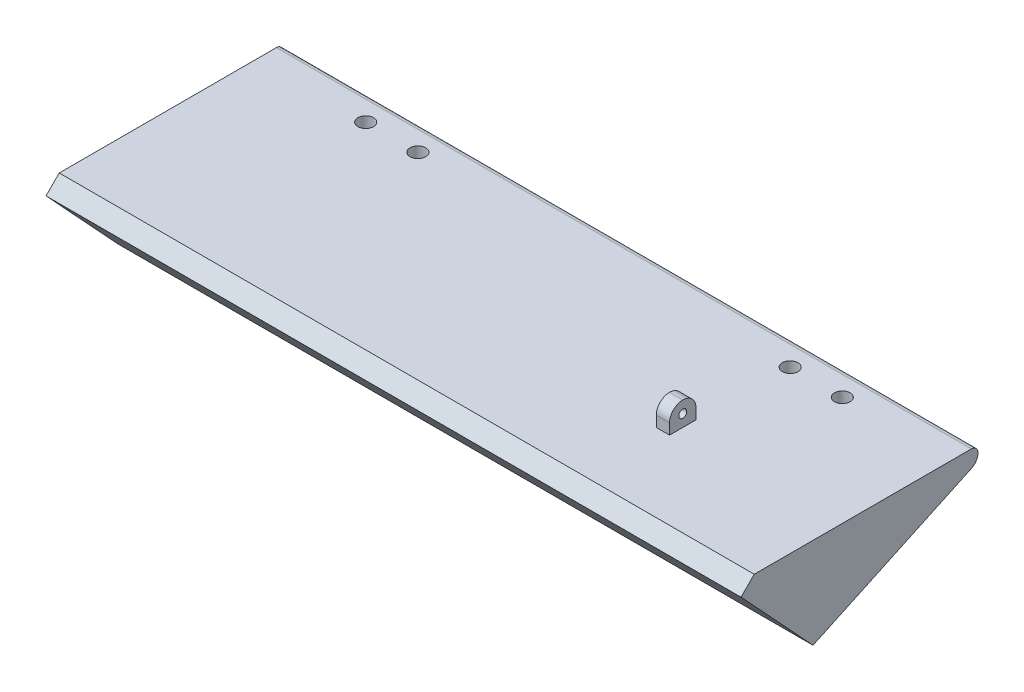
ISO-10303-21;
HEADER;
FILE_DESCRIPTION(('STEP AP214'),'2;1');
FILE_NAME('part.step','',(''),(''),'','','');
FILE_SCHEMA(('AUTOMOTIVE_DESIGN { 1 0 10303 214 1 1 1 1 }'));
ENDSEC;
DATA;
#1=APPLICATION_CONTEXT('core data for automotive mechanical design processes');
#2=APPLICATION_PROTOCOL_DEFINITION('international standard','automotive_design',2000,#1);
#3=PRODUCT_CONTEXT('',#1,'mechanical');
#4=PRODUCT('Part','Part','',(#3));
#5=PRODUCT_RELATED_PRODUCT_CATEGORY('part','',(#4));
#6=PRODUCT_DEFINITION_FORMATION('','',#4);
#7=PRODUCT_DEFINITION_CONTEXT('part definition',#1,'design');
#8=PRODUCT_DEFINITION('design','',#6,#7);
#9=PRODUCT_DEFINITION_SHAPE('','',#8);
#10=(LENGTH_UNIT() NAMED_UNIT(*) SI_UNIT(.MILLI.,.METRE.));
#11=(NAMED_UNIT(*) PLANE_ANGLE_UNIT() SI_UNIT($,.RADIAN.));
#12=(NAMED_UNIT(*) SI_UNIT($,.STERADIAN.) SOLID_ANGLE_UNIT());
#13=UNCERTAINTY_MEASURE_WITH_UNIT(LENGTH_MEASURE(1.E-05),#10,'distance_accuracy_value','');
#14=(GEOMETRIC_REPRESENTATION_CONTEXT(3) GLOBAL_UNCERTAINTY_ASSIGNED_CONTEXT((#13)) GLOBAL_UNIT_ASSIGNED_CONTEXT((#10,
#11,#12)) REPRESENTATION_CONTEXT('',''));
#15=CARTESIAN_POINT('',(0.,0.,0.));
#16=DIRECTION('',(0.,0.,1.));
#17=DIRECTION('',(1.,0.,0.));
#18=AXIS2_PLACEMENT_3D('',#15,#16,#17);
#19=CARTESIAN_POINT('',(0.,2.54,0.));
#20=DIRECTION('',(0.,1.,0.));
#21=DIRECTION('',(0.,0.,1.));
#22=AXIS2_PLACEMENT_3D('',#19,#20,#21);
#23=PLANE('',#22);
#24=CARTESIAN_POINT('',(20.955,2.53999999999997,5.07999999999998));
#25=DIRECTION('',(0.,-1.,0.));
#26=DIRECTION('',(0.,0.,-1.));
#27=AXIS2_PLACEMENT_3D('',#24,#25,#26);
#28=CIRCLE('',#27,1.4986);
#29=CARTESIAN_POINT('',(20.955,2.53999999999997,3.58139999999998));
#30=VERTEX_POINT('',#29);
#31=EDGE_CURVE('E227',#30,#30,#28,.T.);
#32=ORIENTED_EDGE('',*,*,#31,.T.);
#33=EDGE_LOOP('',(#32));
#34=FACE_BOUND('',#33,.T.);
#35=CARTESIAN_POINT('',(30.9626,2.53999999999997,5.07999999999997));
#36=DIRECTION('',(0.,-1.,0.));
#37=DIRECTION('',(0.,0.,-1.));
#38=AXIS2_PLACEMENT_3D('',#35,#36,#37);
#39=CIRCLE('',#38,1.4986);
#40=CARTESIAN_POINT('',(30.9626,2.53999999999997,3.58139999999997));
#41=VERTEX_POINT('',#40);
#42=EDGE_CURVE('E221',#41,#41,#39,.T.);
#43=ORIENTED_EDGE('',*,*,#42,.T.);
#44=EDGE_LOOP('',(#43));
#45=FACE_BOUND('',#44,.T.);
#46=CARTESIAN_POINT('',(102.3874,2.53999999999997,5.07999999999998));
#47=DIRECTION('',(0.,-1.,0.));
#48=DIRECTION('',(0.,0.,-1.));
#49=AXIS2_PLACEMENT_3D('',#46,#47,#48);
#50=CIRCLE('',#49,1.4986);
#51=CARTESIAN_POINT('',(102.3874,2.53999999999997,3.58139999999998));
#52=VERTEX_POINT('',#51);
#53=EDGE_CURVE('E215',#52,#52,#50,.T.);
#54=ORIENTED_EDGE('',*,*,#53,.T.);
#55=EDGE_LOOP('',(#54));
#56=FACE_BOUND('',#55,.T.);
#57=CARTESIAN_POINT('',(112.395,2.53999999999997,5.07999999999998));
#58=DIRECTION('',(0.,-1.,0.));
#59=DIRECTION('',(0.,0.,-1.));
#60=AXIS2_PLACEMENT_3D('',#57,#58,#59);
#61=CIRCLE('',#60,1.4986);
#62=CARTESIAN_POINT('',(112.395,2.53999999999997,3.58139999999998));
#63=VERTEX_POINT('',#62);
#64=EDGE_CURVE('E209',#63,#63,#61,.T.);
#65=ORIENTED_EDGE('',*,*,#64,.T.);
#66=EDGE_LOOP('',(#65));
#67=FACE_BOUND('',#66,.T.);
#68=DIRECTION('',(0.,0.,-1.));
#69=VECTOR('',#68,1.);
#70=CARTESIAN_POINT('',(133.35,2.54,0.));
#71=LINE('',#70,#69);
#72=CARTESIAN_POINT('',(133.35,2.54,42.926));
#73=VERTEX_POINT('',#72);
#74=CARTESIAN_POINT('',(133.35,2.54,1.27));
#75=VERTEX_POINT('',#74);
#76=EDGE_CURVE('E157',#73,#75,#71,.T.);
#77=ORIENTED_EDGE('',*,*,#76,.T.);
#78=DIRECTION('',(-1.,0.,0.));
#79=VECTOR('',#78,1.);
#80=CARTESIAN_POINT('',(0.,2.54,1.27));
#81=LINE('',#80,#79);
#82=CARTESIAN_POINT('',(0.,2.54,1.27));
#83=VERTEX_POINT('',#82);
#84=EDGE_CURVE('E135',#75,#83,#81,.T.);
#85=ORIENTED_EDGE('',*,*,#84,.T.);
#86=DIRECTION('',(0.,0.,1.));
#87=VECTOR('',#86,1.);
#88=CARTESIAN_POINT('',(0.,2.54,0.));
#89=LINE('',#88,#87);
#90=CARTESIAN_POINT('',(0.,2.54,42.926));
#91=VERTEX_POINT('',#90);
#92=EDGE_CURVE('E165',#83,#91,#89,.T.);
#93=ORIENTED_EDGE('',*,*,#92,.T.);
#94=DIRECTION('',(1.,0.,0.));
#95=VECTOR('',#94,1.);
#96=CARTESIAN_POINT('',(0.,2.54,42.926));
#97=LINE('',#96,#95);
#98=EDGE_CURVE('E166',#91,#73,#97,.T.);
#99=ORIENTED_EDGE('',*,*,#98,.T.);
#100=EDGE_LOOP('',(#77,#85,#93,#99));
#101=FACE_BOUND('',#100,.T.);
#102=DIRECTION('',(-1.,0.,0.));
#103=VECTOR('',#102,1.);
#104=CARTESIAN_POINT('',(102.108,2.54,22.86));
#105=LINE('',#104,#103);
#106=CARTESIAN_POINT('',(102.108,2.54,22.86));
#107=VERTEX_POINT('',#106);
#108=CARTESIAN_POINT('',(99.568,2.54,22.86));
#109=VERTEX_POINT('',#108);
#110=EDGE_CURVE('E190',#107,#109,#105,.T.);
#111=ORIENTED_EDGE('',*,*,#110,.F.);
#112=DIRECTION('',(0.,0.,-1.));
#113=VECTOR('',#112,1.);
#114=CARTESIAN_POINT('',(102.108,2.54,27.94));
#115=LINE('',#114,#113);
#116=CARTESIAN_POINT('',(102.108,2.54,27.94));
#117=VERTEX_POINT('',#116);
#118=EDGE_CURVE('E161',#117,#107,#115,.T.);
#119=ORIENTED_EDGE('',*,*,#118,.F.);
#120=DIRECTION('',(1.,0.,0.));
#121=VECTOR('',#120,1.);
#122=CARTESIAN_POINT('',(102.108,2.54,27.94));
#123=LINE('',#122,#121);
#124=CARTESIAN_POINT('',(99.568,2.54,27.94));
#125=VERTEX_POINT('',#124);
#126=EDGE_CURVE('E184',#125,#117,#123,.T.);
#127=ORIENTED_EDGE('',*,*,#126,.F.);
#128=DIRECTION('',(0.,0.,1.));
#129=VECTOR('',#128,1.);
#130=CARTESIAN_POINT('',(99.568,2.54,27.94));
#131=LINE('',#130,#129);
#132=EDGE_CURVE('E187',#109,#125,#131,.T.);
#133=ORIENTED_EDGE('',*,*,#132,.F.);
#134=EDGE_LOOP('',(#111,#119,#127,#133));
#135=FACE_BOUND('',#134,.T.);
#136=ADVANCED_FACE('F36',(#34,#45,#56,#67,#101,#135),#23,.T.);
#137=CARTESIAN_POINT('',(0.,2.54,0.));
#138=DIRECTION('',(1.,0.,0.));
#139=DIRECTION('',(0.,0.,-1.));
#140=AXIS2_PLACEMENT_3D('',#137,#138,#139);
#141=PLANE('',#140);
#142=DIRECTION('',(0.,0.733399200194749,0.679798215026859));
#143=VECTOR('',#142,1.);
#144=CARTESIAN_POINT('',(0.,-22.6676865994659,24.4549968723537));
#145=LINE('',#144,#143);
#146=CARTESIAN_POINT('',(0.,-14.9026717479573,31.6525002706542));
#147=VERTEX_POINT('',#146);
#148=CARTESIAN_POINT('',(0.,0.,45.466));
#149=VERTEX_POINT('',#148);
#150=EDGE_CURVE('E130',#147,#149,#145,.T.);
#151=ORIENTED_EDGE('',*,*,#150,.T.);
#152=DIRECTION('',(0.,0.707106781186544,-0.707106781186552));
#153=VECTOR('',#152,1.);
#154=CARTESIAN_POINT('',(0.,2.54,42.926));
#155=LINE('',#154,#153);
#156=EDGE_CURVE('E171',#149,#91,#155,.T.);
#157=ORIENTED_EDGE('',*,*,#156,.T.);
#158=ORIENTED_EDGE('',*,*,#92,.F.);
#159=CARTESIAN_POINT('',(0.,1.27,1.27));
#160=DIRECTION('',(1.,0.,0.));
#161=DIRECTION('',(0.,0.,-1.));
#162=AXIS2_PLACEMENT_3D('',#159,#160,#161);
#163=CIRCLE('',#162,1.27);
#164=CARTESIAN_POINT('',(0.,1.27,0.));
#165=VERTEX_POINT('',#164);
#166=EDGE_CURVE('E45',#83,#165,#163,.F.);
#167=ORIENTED_EDGE('',*,*,#166,.T.);
#168=CARTESIAN_POINT('',(0.,1.27,2.20060500212836));
#169=DIRECTION('',(-1.,0.,0.));
#170=DIRECTION('',(0.,0.,1.));
#171=AXIS2_PLACEMENT_3D('',#168,#169,#170);
#172=CIRCLE('',#171,2.20060500212836);
#173=CARTESIAN_POINT('',(0.,-0.724150622547361,1.27));
#174=VERTEX_POINT('',#173);
#175=EDGE_CURVE('E52',#174,#165,#172,.F.);
#176=ORIENTED_EDGE('',*,*,#175,.F.);
#177=DIRECTION('',(0.,0.422885979641193,-0.906182899983722));
#178=VECTOR('',#177,1.);
#179=CARTESIAN_POINT('',(0.,-0.107969623736231,-0.0503858990342978));
#180=LINE('',#179,#178);
#181=EDGE_CURVE('E203',#147,#174,#180,.T.);
#182=ORIENTED_EDGE('',*,*,#181,.F.);
#183=EDGE_LOOP('',(#151,#157,#158,#167,#176,#182));
#184=FACE_BOUND('',#183,.T.);
#185=ADVANCED_FACE('F245',(#184),#141,.F.);
#186=CARTESIAN_POINT('',(133.35,2.54,0.));
#187=DIRECTION('',(-1.,0.,0.));
#188=DIRECTION('',(0.,0.,1.));
#189=AXIS2_PLACEMENT_3D('',#186,#187,#188);
#190=PLANE('',#189);
#191=DIRECTION('',(0.,0.707106781186544,-0.707106781186552));
#192=VECTOR('',#191,1.);
#193=CARTESIAN_POINT('',(133.35,2.54,42.926));
#194=LINE('',#193,#192);
#195=CARTESIAN_POINT('',(133.35,0.,45.466));
#196=VERTEX_POINT('',#195);
#197=EDGE_CURVE('E172',#196,#73,#194,.T.);
#198=ORIENTED_EDGE('',*,*,#197,.F.);
#199=DIRECTION('',(0.,0.733399200194749,0.679798215026859));
#200=VECTOR('',#199,1.);
#201=CARTESIAN_POINT('',(133.35,-22.6676865994659,24.4549968723537));
#202=LINE('',#201,#200);
#203=CARTESIAN_POINT('',(133.35,-14.9026717479573,31.6525002706542));
#204=VERTEX_POINT('',#203);
#205=EDGE_CURVE('E199',#204,#196,#202,.T.);
#206=ORIENTED_EDGE('',*,*,#205,.F.);
#207=DIRECTION('',(0.,0.422885979641193,-0.906182899983722));
#208=VECTOR('',#207,1.);
#209=CARTESIAN_POINT('',(133.35,-0.107969623736231,-0.0503858990343142));
#210=LINE('',#209,#208);
#211=CARTESIAN_POINT('',(133.35,-0.724150622547361,1.26999999999998));
#212=VERTEX_POINT('',#211);
#213=EDGE_CURVE('E128',#204,#212,#210,.T.);
#214=ORIENTED_EDGE('',*,*,#213,.T.);
#215=CARTESIAN_POINT('',(133.35,1.27,2.20060500212835));
#216=DIRECTION('',(-1.,0.,0.));
#217=DIRECTION('',(0.,0.,1.));
#218=AXIS2_PLACEMENT_3D('',#215,#216,#217);
#219=CIRCLE('',#218,2.20060500212836);
#220=CARTESIAN_POINT('',(133.35,1.27,0.));
#221=VERTEX_POINT('',#220);
#222=EDGE_CURVE('E120',#212,#221,#219,.F.);
#223=ORIENTED_EDGE('',*,*,#222,.T.);
#224=CARTESIAN_POINT('',(133.35,1.27,1.27));
#225=DIRECTION('',(-1.,0.,0.));
#226=DIRECTION('',(0.,0.,1.));
#227=AXIS2_PLACEMENT_3D('',#224,#225,#226);
#228=CIRCLE('',#227,1.27);
#229=EDGE_CURVE('E11',#221,#75,#228,.F.);
#230=ORIENTED_EDGE('',*,*,#229,.T.);
#231=ORIENTED_EDGE('',*,*,#76,.F.);
#232=EDGE_LOOP('',(#198,#206,#214,#223,#230,#231));
#233=FACE_BOUND('',#232,.T.);
#234=ADVANCED_FACE('F122',(#233),#190,.F.);
#235=CARTESIAN_POINT('',(0.,2.54,42.926));
#236=DIRECTION('',(0.,-0.707106781186551,-0.707106781186543));
#237=DIRECTION('',(0.,0.707106781186544,-0.707106781186552));
#238=AXIS2_PLACEMENT_3D('',#235,#236,#237);
#239=PLANE('',#238);
#240=ORIENTED_EDGE('',*,*,#197,.T.);
#241=ORIENTED_EDGE('',*,*,#98,.F.);
#242=ORIENTED_EDGE('',*,*,#156,.F.);
#243=DIRECTION('',(1.,0.,0.));
#244=VECTOR('',#243,1.);
#245=CARTESIAN_POINT('',(0.,0.,45.466));
#246=LINE('',#245,#244);
#247=EDGE_CURVE('E162',#149,#196,#246,.T.);
#248=ORIENTED_EDGE('',*,*,#247,.T.);
#249=EDGE_LOOP('',(#240,#241,#242,#248));
#250=FACE_BOUND('',#249,.T.);
#251=ADVANCED_FACE('F256',(#250),#239,.F.);
#252=CARTESIAN_POINT('',(102.108,7.112,27.94));
#253=DIRECTION('',(-1.,0.,0.));
#254=DIRECTION('',(0.,0.,1.));
#255=AXIS2_PLACEMENT_3D('',#252,#253,#254);
#256=PLANE('',#255);
#257=CARTESIAN_POINT('',(102.108,4.826,25.4));
#258=DIRECTION('',(1.,0.,0.));
#259=DIRECTION('',(0.,0.,-1.));
#260=AXIS2_PLACEMENT_3D('',#257,#258,#259);
#261=CIRCLE('',#260,0.761999999999999);
#262=CARTESIAN_POINT('',(102.108,4.826,24.638));
#263=VERTEX_POINT('',#262);
#264=EDGE_CURVE('E133',#263,#263,#261,.T.);
#265=ORIENTED_EDGE('',*,*,#264,.F.);
#266=EDGE_LOOP('',(#265));
#267=FACE_BOUND('',#266,.T.);
#268=DIRECTION('',(0.,-1.,0.));
#269=VECTOR('',#268,1.);
#270=CARTESIAN_POINT('',(102.108,7.112,22.86));
#271=LINE('',#270,#269);
#272=CARTESIAN_POINT('',(102.108,4.572,22.86));
#273=VERTEX_POINT('',#272);
#274=EDGE_CURVE('E174',#273,#107,#271,.T.);
#275=ORIENTED_EDGE('',*,*,#274,.F.);
#276=CARTESIAN_POINT('',(102.108,4.572,25.4));
#277=DIRECTION('',(-1.,0.,0.));
#278=DIRECTION('',(0.,0.,1.));
#279=AXIS2_PLACEMENT_3D('',#276,#277,#278);
#280=CIRCLE('',#279,2.54);
#281=CARTESIAN_POINT('',(102.108,7.112,25.4));
#282=VERTEX_POINT('',#281);
#283=EDGE_CURVE('E138',#273,#282,#280,.F.);
#284=ORIENTED_EDGE('',*,*,#283,.T.);
#285=CARTESIAN_POINT('',(102.108,4.572,25.4));
#286=DIRECTION('',(-1.,0.,0.));
#287=DIRECTION('',(0.,0.,1.));
#288=AXIS2_PLACEMENT_3D('',#285,#286,#287);
#289=CIRCLE('',#288,2.54);
#290=CARTESIAN_POINT('',(102.108,4.572,27.94));
#291=VERTEX_POINT('',#290);
#292=EDGE_CURVE('E152',#282,#291,#289,.F.);
#293=ORIENTED_EDGE('',*,*,#292,.T.);
#294=DIRECTION('',(0.,-1.,0.));
#295=VECTOR('',#294,1.);
#296=CARTESIAN_POINT('',(102.108,7.112,27.94));
#297=LINE('',#296,#295);
#298=EDGE_CURVE('E182',#291,#117,#297,.T.);
#299=ORIENTED_EDGE('',*,*,#298,.T.);
#300=ORIENTED_EDGE('',*,*,#118,.T.);
#301=EDGE_LOOP('',(#275,#284,#293,#299,#300));
#302=FACE_BOUND('',#301,.T.);
#303=ADVANCED_FACE('F277',(#267,#302),#256,.F.);
#304=CARTESIAN_POINT('',(102.108,7.112,22.86));
#305=DIRECTION('',(0.,0.,1.));
#306=DIRECTION('',(1.,0.,0.));
#307=AXIS2_PLACEMENT_3D('',#304,#305,#306);
#308=PLANE('',#307);
#309=DIRECTION('',(0.,-1.,0.));
#310=VECTOR('',#309,1.);
#311=CARTESIAN_POINT('',(99.568,7.112,22.86));
#312=LINE('',#311,#310);
#313=CARTESIAN_POINT('',(99.568,4.572,22.86));
#314=VERTEX_POINT('',#313);
#315=EDGE_CURVE('E178',#314,#109,#312,.T.);
#316=ORIENTED_EDGE('',*,*,#315,.F.);
#317=DIRECTION('',(-1.,0.,0.));
#318=VECTOR('',#317,1.);
#319=CARTESIAN_POINT('',(102.108,4.572,22.86));
#320=LINE('',#319,#318);
#321=EDGE_CURVE('E141',#314,#273,#320,.F.);
#322=ORIENTED_EDGE('',*,*,#321,.T.);
#323=ORIENTED_EDGE('',*,*,#274,.T.);
#324=ORIENTED_EDGE('',*,*,#110,.T.);
#325=EDGE_LOOP('',(#316,#322,#323,#324));
#326=FACE_BOUND('',#325,.T.);
#327=ADVANCED_FACE('F293',(#326),#308,.F.);
#328=CARTESIAN_POINT('',(99.568,7.112,27.94));
#329=DIRECTION('',(1.,0.,0.));
#330=DIRECTION('',(0.,0.,-1.));
#331=AXIS2_PLACEMENT_3D('',#328,#329,#330);
#332=PLANE('',#331);
#333=CARTESIAN_POINT('',(99.568,4.826,25.4));
#334=DIRECTION('',(1.,0.,0.));
#335=DIRECTION('',(0.,0.,-1.));
#336=AXIS2_PLACEMENT_3D('',#333,#334,#335);
#337=CIRCLE('',#336,0.761999999999999);
#338=CARTESIAN_POINT('',(99.568,4.826,24.638));
#339=VERTEX_POINT('',#338);
#340=EDGE_CURVE('E158',#339,#339,#337,.T.);
#341=ORIENTED_EDGE('',*,*,#340,.T.);
#342=EDGE_LOOP('',(#341));
#343=FACE_BOUND('',#342,.T.);
#344=CARTESIAN_POINT('',(99.568,4.572,25.4));
#345=DIRECTION('',(1.,0.,0.));
#346=DIRECTION('',(0.,0.,-1.));
#347=AXIS2_PLACEMENT_3D('',#344,#345,#346);
#348=CIRCLE('',#347,2.54);
#349=CARTESIAN_POINT('',(99.568,4.572,27.94));
#350=VERTEX_POINT('',#349);
#351=CARTESIAN_POINT('',(99.568,7.112,25.4));
#352=VERTEX_POINT('',#351);
#353=EDGE_CURVE('E147',#350,#352,#348,.F.);
#354=ORIENTED_EDGE('',*,*,#353,.T.);
#355=CARTESIAN_POINT('',(99.568,4.572,25.4));
#356=DIRECTION('',(1.,0.,0.));
#357=DIRECTION('',(0.,0.,-1.));
#358=AXIS2_PLACEMENT_3D('',#355,#356,#357);
#359=CIRCLE('',#358,2.54);
#360=EDGE_CURVE('E145',#352,#314,#359,.F.);
#361=ORIENTED_EDGE('',*,*,#360,.T.);
#362=ORIENTED_EDGE('',*,*,#315,.T.);
#363=ORIENTED_EDGE('',*,*,#132,.T.);
#364=DIRECTION('',(0.,-1.,0.));
#365=VECTOR('',#364,1.);
#366=CARTESIAN_POINT('',(99.568,7.112,27.94));
#367=LINE('',#366,#365);
#368=EDGE_CURVE('E180',#350,#125,#367,.T.);
#369=ORIENTED_EDGE('',*,*,#368,.F.);
#370=EDGE_LOOP('',(#354,#361,#362,#363,#369));
#371=FACE_BOUND('',#370,.T.);
#372=ADVANCED_FACE('F285',(#343,#371),#332,.F.);
#373=CARTESIAN_POINT('',(102.108,7.112,27.94));
#374=DIRECTION('',(0.,0.,-1.));
#375=DIRECTION('',(-1.,0.,0.));
#376=AXIS2_PLACEMENT_3D('',#373,#374,#375);
#377=PLANE('',#376);
#378=ORIENTED_EDGE('',*,*,#298,.F.);
#379=DIRECTION('',(1.,0.,0.));
#380=VECTOR('',#379,1.);
#381=CARTESIAN_POINT('',(99.568,4.572,27.94));
#382=LINE('',#381,#380);
#383=EDGE_CURVE('E150',#291,#350,#382,.F.);
#384=ORIENTED_EDGE('',*,*,#383,.T.);
#385=ORIENTED_EDGE('',*,*,#368,.T.);
#386=ORIENTED_EDGE('',*,*,#126,.T.);
#387=EDGE_LOOP('',(#378,#384,#385,#386));
#388=FACE_BOUND('',#387,.T.);
#389=ADVANCED_FACE('F283',(#388),#377,.F.);
#390=CARTESIAN_POINT('',(0.,4.826,25.4));
#391=DIRECTION('',(1.,0.,0.));
#392=DIRECTION('',(0.,0.,-1.));
#393=AXIS2_PLACEMENT_3D('',#390,#391,#392);
#394=CYLINDRICAL_SURFACE('',#393,0.761999999999999);
#395=CARTESIAN_POINT('',(102.108,4.826,24.638));
#396=CARTESIAN_POINT('',(102.081541666667,4.826,24.638));
#397=CARTESIAN_POINT('',(102.055083333333,4.826,24.638));
#398=CARTESIAN_POINT('',(102.002166666667,4.826,24.638));
#399=CARTESIAN_POINT('',(101.975708333333,4.826,24.638));
#400=CARTESIAN_POINT('',(101.922791666667,4.826,24.638));
#401=CARTESIAN_POINT('',(101.896333333333,4.826,24.638));
#402=CARTESIAN_POINT('',(101.843416666667,4.826,24.638));
#403=CARTESIAN_POINT('',(101.816958333333,4.826,24.638));
#404=CARTESIAN_POINT('',(101.764041666667,4.826,24.638));
#405=CARTESIAN_POINT('',(101.737583333333,4.826,24.638));
#406=CARTESIAN_POINT('',(101.684666666667,4.826,24.638));
#407=CARTESIAN_POINT('',(101.658208333333,4.826,24.638));
#408=CARTESIAN_POINT('',(101.605291666667,4.826,24.638));
#409=CARTESIAN_POINT('',(101.578833333333,4.826,24.638));
#410=CARTESIAN_POINT('',(101.525916666667,4.826,24.638));
#411=CARTESIAN_POINT('',(101.499458333333,4.826,24.638));
#412=CARTESIAN_POINT('',(101.446541666667,4.826,24.638));
#413=CARTESIAN_POINT('',(101.420083333333,4.826,24.638));
#414=CARTESIAN_POINT('',(101.367166666667,4.826,24.638));
#415=CARTESIAN_POINT('',(101.340708333333,4.826,24.638));
#416=CARTESIAN_POINT('',(101.287791666667,4.826,24.638));
#417=CARTESIAN_POINT('',(101.261333333333,4.826,24.638));
#418=CARTESIAN_POINT('',(101.208416666667,4.826,24.638));
#419=CARTESIAN_POINT('',(101.181958333333,4.826,24.638));
#420=CARTESIAN_POINT('',(101.129041666667,4.826,24.638));
#421=CARTESIAN_POINT('',(101.102583333333,4.826,24.638));
#422=CARTESIAN_POINT('',(101.049666666667,4.826,24.638));
#423=CARTESIAN_POINT('',(101.023208333333,4.826,24.638));
#424=CARTESIAN_POINT('',(100.970291666667,4.826,24.638));
#425=CARTESIAN_POINT('',(100.943833333333,4.826,24.638));
#426=CARTESIAN_POINT('',(100.890916666667,4.826,24.638));
#427=CARTESIAN_POINT('',(100.864458333333,4.826,24.638));
#428=CARTESIAN_POINT('',(100.811541666667,4.826,24.638));
#429=CARTESIAN_POINT('',(100.785083333333,4.826,24.638));
#430=CARTESIAN_POINT('',(100.732166666667,4.826,24.638));
#431=CARTESIAN_POINT('',(100.705708333333,4.826,24.638));
#432=CARTESIAN_POINT('',(100.652791666667,4.826,24.638));
#433=CARTESIAN_POINT('',(100.626333333333,4.826,24.638));
#434=CARTESIAN_POINT('',(100.573416666667,4.826,24.638));
#435=CARTESIAN_POINT('',(100.546958333333,4.826,24.638));
#436=CARTESIAN_POINT('',(100.494041666667,4.826,24.638));
#437=CARTESIAN_POINT('',(100.467583333333,4.826,24.638));
#438=CARTESIAN_POINT('',(100.414666666667,4.826,24.638));
#439=CARTESIAN_POINT('',(100.388208333333,4.826,24.638));
#440=CARTESIAN_POINT('',(100.335291666667,4.826,24.638));
#441=CARTESIAN_POINT('',(100.308833333333,4.826,24.638));
#442=CARTESIAN_POINT('',(100.255916666667,4.826,24.638));
#443=CARTESIAN_POINT('',(100.229458333333,4.826,24.638));
#444=CARTESIAN_POINT('',(100.176541666667,4.826,24.638));
#445=CARTESIAN_POINT('',(100.150083333333,4.826,24.638));
#446=CARTESIAN_POINT('',(100.097166666667,4.826,24.638));
#447=CARTESIAN_POINT('',(100.070708333333,4.826,24.638));
#448=CARTESIAN_POINT('',(100.017791666667,4.826,24.638));
#449=CARTESIAN_POINT('',(99.9913333333333,4.826,24.638));
#450=CARTESIAN_POINT('',(99.9384166666667,4.826,24.638));
#451=CARTESIAN_POINT('',(99.9119583333333,4.826,24.638));
#452=CARTESIAN_POINT('',(99.8590416666667,4.826,24.638));
#453=CARTESIAN_POINT('',(99.8325833333333,4.826,24.638));
#454=CARTESIAN_POINT('',(99.7796666666667,4.826,24.638));
#455=CARTESIAN_POINT('',(99.7532083333333,4.826,24.638));
#456=CARTESIAN_POINT('',(99.7002916666667,4.826,24.638));
#457=CARTESIAN_POINT('',(99.6738333333333,4.826,24.638));
#458=CARTESIAN_POINT('',(99.6209166666667,4.826,24.638));
#459=CARTESIAN_POINT('',(99.5944583333333,4.826,24.638));
#460=CARTESIAN_POINT('',(99.568,4.826,24.638));
#461=B_SPLINE_CURVE_WITH_KNOTS('',3,(#395,#396,#397,#398,#399,#400,#401,#402,#403,#404,#405,
#406,#407,#408,#409,#410,#411,#412,#413,#414,#415,#416,#417,#418,#419,#420,#421,#422,#423,#424,
#425,#426,#427,#428,#429,#430,#431,#432,#433,#434,#435,#436,#437,#438,#439,#440,#441,#442,#443,
#444,#445,#446,#447,#448,#449,#450,#451,#452,#453,#454,#455,#456,#457,#458,#459,#460),
.UNSPECIFIED.,.F.,.F.,(4,2,2,2,2,2,2,2,2,2,2,2,2,2,2,2,2,2,2,2,2,2,2,2,2,2,2,2,2,2,2,2,4),(0.,
0.0793749999999926,0.158749999999999,0.238125000000006,0.317499999999998,0.396874999999991,
0.476249999999998,0.555625000000004,0.634999999999997,0.714374999999989,0.793749999999996,
0.873125000000002,0.952499999999995,1.03187499999999,1.11124999999999,1.190625,1.26999999999999,
1.34937499999999,1.42874999999999,1.508125,1.58749999999999,1.66687499999998,1.74624999999999,
1.825625,1.90499999999999,1.98437499999998,2.06374999999999,2.143125,2.22249999999999,
2.30187499999998,2.38124999999999,2.46062499999999,2.53999999999999),.UNSPECIFIED.);
#462=EDGE_CURVE('BSEAM263',#263,#339,#461,.T.);
#463=ORIENTED_EDGE('',*,*,#264,.T.);
#464=ORIENTED_EDGE('',*,*,#340,.F.);
#465=ORIENTED_EDGE('',*,*,#462,.T.);
#466=ORIENTED_EDGE('',*,*,#462,.F.);
#467=EDGE_LOOP('',(#463,#465,#464,#466));
#468=FACE_BOUND('',#467,.T.);
#469=ADVANCED_FACE('F263',(#468),#394,.F.);
#470=CARTESIAN_POINT('',(0.,4.572,25.4));
#471=DIRECTION('',(-1.,0.,0.));
#472=DIRECTION('',(0.,0.,1.));
#473=AXIS2_PLACEMENT_3D('',#470,#471,#472);
#474=CYLINDRICAL_SURFACE('',#473,2.54);
#475=ORIENTED_EDGE('',*,*,#353,.F.);
#476=ORIENTED_EDGE('',*,*,#383,.F.);
#477=ORIENTED_EDGE('',*,*,#292,.F.);
#478=DIRECTION('',(1.,0.,0.));
#479=VECTOR('',#478,1.);
#480=CARTESIAN_POINT('',(102.108,7.112,25.4));
#481=LINE('',#480,#479);
#482=EDGE_CURVE('E154',#352,#282,#481,.T.);
#483=ORIENTED_EDGE('',*,*,#482,.F.);
#484=EDGE_LOOP('',(#475,#476,#477,#483));
#485=FACE_BOUND('',#484,.T.);
#486=ADVANCED_FACE('F260',(#485),#474,.T.);
#487=CARTESIAN_POINT('',(0.,4.572,25.3999999999999));
#488=DIRECTION('',(1.,0.,0.));
#489=DIRECTION('',(0.,0.,-1.));
#490=AXIS2_PLACEMENT_3D('',#487,#488,#489);
#491=CYLINDRICAL_SURFACE('',#490,2.54);
#492=ORIENTED_EDGE('',*,*,#283,.F.);
#493=ORIENTED_EDGE('',*,*,#321,.F.);
#494=ORIENTED_EDGE('',*,*,#360,.F.);
#495=ORIENTED_EDGE('',*,*,#482,.T.);
#496=EDGE_LOOP('',(#492,#493,#494,#495));
#497=FACE_BOUND('',#496,.T.);
#498=ADVANCED_FACE('F262',(#497),#491,.T.);
#499=CARTESIAN_POINT('',(0.,1.27,1.27));
#500=DIRECTION('',(1.,0.,0.));
#501=DIRECTION('',(0.,0.,-1.));
#502=AXIS2_PLACEMENT_3D('',#499,#500,#501);
#503=CYLINDRICAL_SURFACE('',#502,1.27);
#504=ORIENTED_EDGE('',*,*,#229,.F.);
#505=DIRECTION('',(-1.,0.,0.));
#506=VECTOR('',#505,1.);
#507=CARTESIAN_POINT('',(0.,1.27,0.));
#508=LINE('',#507,#506);
#509=EDGE_CURVE('E40',#221,#165,#508,.T.);
#510=ORIENTED_EDGE('',*,*,#509,.T.);
#511=ORIENTED_EDGE('',*,*,#166,.F.);
#512=ORIENTED_EDGE('',*,*,#84,.F.);
#513=EDGE_LOOP('',(#504,#510,#511,#512));
#514=FACE_BOUND('',#513,.T.);
#515=ADVANCED_FACE('F38',(#514),#503,.T.);
#516=CARTESIAN_POINT('',(133.35,-22.6676865994659,24.4549968723537));
#517=DIRECTION('',(0.,-0.679798215026859,0.733399200194749));
#518=DIRECTION('',(0.,-0.733399200194749,-0.679798215026859));
#519=AXIS2_PLACEMENT_3D('',#516,#517,#518);
#520=PLANE('',#519);
#521=ORIENTED_EDGE('',*,*,#150,.F.);
#522=DIRECTION('',(-1.,0.,0.));
#523=VECTOR('',#522,1.);
#524=CARTESIAN_POINT('',(133.35,-14.9026717479573,31.6525002706542));
#525=LINE('',#524,#523);
#526=EDGE_CURVE('E134',#204,#147,#525,.T.);
#527=ORIENTED_EDGE('',*,*,#526,.F.);
#528=ORIENTED_EDGE('',*,*,#205,.T.);
#529=ORIENTED_EDGE('',*,*,#247,.F.);
#530=EDGE_LOOP('',(#521,#527,#528,#529));
#531=FACE_BOUND('',#530,.T.);
#532=ADVANCED_FACE('F270',(#531),#520,.T.);
#533=CARTESIAN_POINT('',(133.35,-0.107969623736231,-0.0503858990343142));
#534=DIRECTION('',(0.,0.906182899983722,0.422885979641193));
#535=DIRECTION('',(0.,-0.422885979641193,0.906182899983722));
#536=AXIS2_PLACEMENT_3D('',#533,#534,#535);
#537=PLANE('',#536);
#538=ORIENTED_EDGE('',*,*,#181,.T.);
#539=DIRECTION('',(-1.,0.,0.));
#540=VECTOR('',#539,1.);
#541=CARTESIAN_POINT('',(133.35,-0.724150622547361,1.26999999999998));
#542=LINE('',#541,#540);
#543=EDGE_CURVE('E197',#212,#174,#542,.T.);
#544=ORIENTED_EDGE('',*,*,#543,.F.);
#545=ORIENTED_EDGE('',*,*,#213,.F.);
#546=ORIENTED_EDGE('',*,*,#526,.T.);
#547=EDGE_LOOP('',(#538,#544,#545,#546));
#548=FACE_BOUND('',#547,.T.);
#549=ADVANCED_FACE('F312',(#548),#537,.F.);
#550=CARTESIAN_POINT('',(133.35,1.27,2.20060500212835));
#551=DIRECTION('',(-1.,0.,0.));
#552=DIRECTION('',(0.,0.,1.));
#553=AXIS2_PLACEMENT_3D('',#550,#551,#552);
#554=CYLINDRICAL_SURFACE('',#553,2.20060500212836);
#555=ORIENTED_EDGE('',*,*,#175,.T.);
#556=ORIENTED_EDGE('',*,*,#509,.F.);
#557=ORIENTED_EDGE('',*,*,#222,.F.);
#558=ORIENTED_EDGE('',*,*,#543,.T.);
#559=EDGE_LOOP('',(#555,#556,#557,#558));
#560=FACE_BOUND('',#559,.T.);
#561=ADVANCED_FACE('F132',(#560),#554,.T.);
#562=CARTESIAN_POINT('',(112.395,0.,5.07999999999998));
#563=DIRECTION('',(0.,1.,0.));
#564=DIRECTION('',(0.,0.,1.));
#565=AXIS2_PLACEMENT_3D('',#562,#563,#564);
#566=CYLINDRICAL_SURFACE('',#565,1.4986);
#567=CARTESIAN_POINT('',(112.395,0.,5.07999999999998));
#568=DIRECTION('',(0.,-1.,0.));
#569=DIRECTION('',(0.,0.,-1.));
#570=AXIS2_PLACEMENT_3D('',#567,#568,#569);
#571=CIRCLE('',#570,1.4986);
#572=CARTESIAN_POINT('',(112.395,0.,3.58139999999998));
#573=VERTEX_POINT('',#572);
#574=EDGE_CURVE('E212',#573,#573,#571,.T.);
#575=ORIENTED_EDGE('',*,*,#574,.T.);
#576=EDGE_LOOP('',(#575));
#577=FACE_BOUND('',#576,.T.);
#578=ORIENTED_EDGE('',*,*,#64,.F.);
#579=EDGE_LOOP('',(#578));
#580=FACE_BOUND('',#579,.T.);
#581=ADVANCED_FACE('F311',(#577,#580),#566,.F.);
#582=CARTESIAN_POINT('',(112.395,0.,5.07999999999998));
#583=DIRECTION('',(0.,-1.,0.));
#584=DIRECTION('',(0.,0.,-1.));
#585=AXIS2_PLACEMENT_3D('',#582,#583,#584);
#586=PLANE('',#585);
#587=ORIENTED_EDGE('',*,*,#574,.F.);
#588=EDGE_LOOP('',(#587));
#589=FACE_BOUND('',#588,.T.);
#590=ADVANCED_FACE('F321',(#589),#586,.F.);
#591=CARTESIAN_POINT('',(102.3874,0.,5.07999999999998));
#592=DIRECTION('',(0.,1.,0.));
#593=DIRECTION('',(0.,0.,1.));
#594=AXIS2_PLACEMENT_3D('',#591,#592,#593);
#595=CYLINDRICAL_SURFACE('',#594,1.4986);
#596=CARTESIAN_POINT('',(102.3874,0.,5.07999999999998));
#597=DIRECTION('',(0.,-1.,0.));
#598=DIRECTION('',(0.,0.,-1.));
#599=AXIS2_PLACEMENT_3D('',#596,#597,#598);
#600=CIRCLE('',#599,1.4986);
#601=CARTESIAN_POINT('',(102.3874,0.,3.58139999999998));
#602=VERTEX_POINT('',#601);
#603=EDGE_CURVE('E218',#602,#602,#600,.T.);
#604=ORIENTED_EDGE('',*,*,#603,.T.);
#605=EDGE_LOOP('',(#604));
#606=FACE_BOUND('',#605,.T.);
#607=ORIENTED_EDGE('',*,*,#53,.F.);
#608=EDGE_LOOP('',(#607));
#609=FACE_BOUND('',#608,.T.);
#610=ADVANCED_FACE('F325',(#606,#609),#595,.F.);
#611=CARTESIAN_POINT('',(102.3874,0.,5.07999999999998));
#612=DIRECTION('',(0.,-1.,0.));
#613=DIRECTION('',(0.,0.,-1.));
#614=AXIS2_PLACEMENT_3D('',#611,#612,#613);
#615=PLANE('',#614);
#616=ORIENTED_EDGE('',*,*,#603,.F.);
#617=EDGE_LOOP('',(#616));
#618=FACE_BOUND('',#617,.T.);
#619=ADVANCED_FACE('F329',(#618),#615,.F.);
#620=CARTESIAN_POINT('',(30.9626,0.,5.07999999999997));
#621=DIRECTION('',(0.,1.,0.));
#622=DIRECTION('',(0.,0.,1.));
#623=AXIS2_PLACEMENT_3D('',#620,#621,#622);
#624=CYLINDRICAL_SURFACE('',#623,1.4986);
#625=CARTESIAN_POINT('',(30.9626,0.,5.07999999999997));
#626=DIRECTION('',(0.,-1.,0.));
#627=DIRECTION('',(0.,0.,-1.));
#628=AXIS2_PLACEMENT_3D('',#625,#626,#627);
#629=CIRCLE('',#628,1.4986);
#630=CARTESIAN_POINT('',(30.9626,0.,3.58139999999997));
#631=VERTEX_POINT('',#630);
#632=EDGE_CURVE('E224',#631,#631,#629,.T.);
#633=ORIENTED_EDGE('',*,*,#632,.T.);
#634=EDGE_LOOP('',(#633));
#635=FACE_BOUND('',#634,.T.);
#636=ORIENTED_EDGE('',*,*,#42,.F.);
#637=EDGE_LOOP('',(#636));
#638=FACE_BOUND('',#637,.T.);
#639=ADVANCED_FACE('F333',(#635,#638),#624,.F.);
#640=CARTESIAN_POINT('',(30.9626,0.,5.07999999999997));
#641=DIRECTION('',(0.,-1.,0.));
#642=DIRECTION('',(0.,0.,-1.));
#643=AXIS2_PLACEMENT_3D('',#640,#641,#642);
#644=PLANE('',#643);
#645=ORIENTED_EDGE('',*,*,#632,.F.);
#646=EDGE_LOOP('',(#645));
#647=FACE_BOUND('',#646,.T.);
#648=ADVANCED_FACE('F242',(#647),#644,.F.);
#649=CARTESIAN_POINT('',(20.955,0.,5.07999999999998));
#650=DIRECTION('',(0.,1.,0.));
#651=DIRECTION('',(0.,0.,1.));
#652=AXIS2_PLACEMENT_3D('',#649,#650,#651);
#653=CYLINDRICAL_SURFACE('',#652,1.4986);
#654=CARTESIAN_POINT('',(20.955,0.,5.07999999999998));
#655=DIRECTION('',(0.,-1.,0.));
#656=DIRECTION('',(0.,0.,-1.));
#657=AXIS2_PLACEMENT_3D('',#654,#655,#656);
#658=CIRCLE('',#657,1.4986);
#659=CARTESIAN_POINT('',(20.955,0.,3.58139999999998));
#660=VERTEX_POINT('',#659);
#661=EDGE_CURVE('E206',#660,#660,#658,.T.);
#662=ORIENTED_EDGE('',*,*,#661,.T.);
#663=EDGE_LOOP('',(#662));
#664=FACE_BOUND('',#663,.T.);
#665=ORIENTED_EDGE('',*,*,#31,.F.);
#666=EDGE_LOOP('',(#665));
#667=FACE_BOUND('',#666,.T.);
#668=ADVANCED_FACE('F233',(#664,#667),#653,.F.);
#669=CARTESIAN_POINT('',(20.955,0.,5.07999999999998));
#670=DIRECTION('',(0.,-1.,0.));
#671=DIRECTION('',(0.,0.,-1.));
#672=AXIS2_PLACEMENT_3D('',#669,#670,#671);
#673=PLANE('',#672);
#674=ORIENTED_EDGE('',*,*,#661,.F.);
#675=EDGE_LOOP('',(#674));
#676=FACE_BOUND('',#675,.T.);
#677=ADVANCED_FACE('F236',(#676),#673,.F.);
#678=CLOSED_SHELL('',(#136,#185,#234,#251,#303,#327,#372,#389,#469,#486,#498,#515,#532,#549,
#561,#581,#590,#610,#619,#639,#648,#668,#677));
#679=MANIFOLD_SOLID_BREP('B2',#678);
#680=ADVANCED_BREP_SHAPE_REPRESENTATION('',(#18,#679),#14);
#681=SHAPE_DEFINITION_REPRESENTATION(#9,#680);
ENDSEC;
END-ISO-10303-21;
